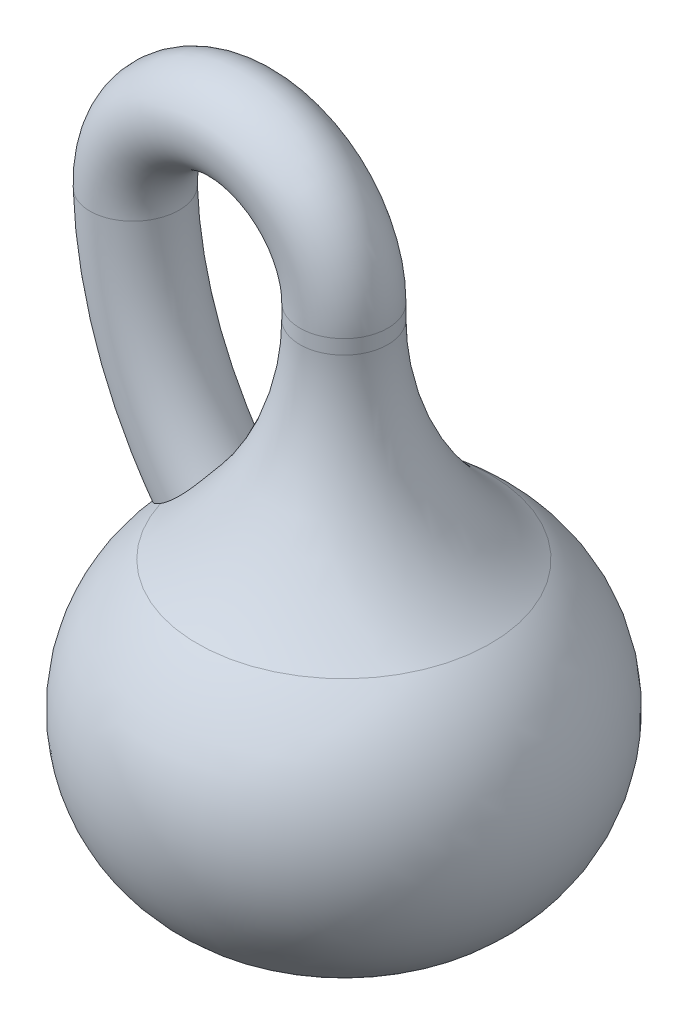
ISO-10303-21;
HEADER;
FILE_DESCRIPTION(('STEP AP214'),'2;1');
FILE_NAME('part.step','',(''),(''),'','','');
FILE_SCHEMA(('AUTOMOTIVE_DESIGN { 1 0 10303 214 1 1 1 1 }'));
ENDSEC;
DATA;
#1=APPLICATION_CONTEXT('core data for automotive mechanical design processes');
#2=APPLICATION_PROTOCOL_DEFINITION('international standard','automotive_design',2000,#1);
#3=PRODUCT_CONTEXT('',#1,'mechanical');
#4=PRODUCT('Part','Part','',(#3));
#5=PRODUCT_RELATED_PRODUCT_CATEGORY('part','',(#4));
#6=PRODUCT_DEFINITION_FORMATION('','',#4);
#7=PRODUCT_DEFINITION_CONTEXT('part definition',#1,'design');
#8=PRODUCT_DEFINITION('design','',#6,#7);
#9=PRODUCT_DEFINITION_SHAPE('','',#8);
#10=(LENGTH_UNIT() NAMED_UNIT(*) SI_UNIT(.MILLI.,.METRE.));
#11=(NAMED_UNIT(*) PLANE_ANGLE_UNIT() SI_UNIT($,.RADIAN.));
#12=(NAMED_UNIT(*) SI_UNIT($,.STERADIAN.) SOLID_ANGLE_UNIT());
#13=UNCERTAINTY_MEASURE_WITH_UNIT(LENGTH_MEASURE(1.E-05),#10,'distance_accuracy_value','');
#14=(GEOMETRIC_REPRESENTATION_CONTEXT(3) GLOBAL_UNCERTAINTY_ASSIGNED_CONTEXT((#13)) GLOBAL_UNIT_ASSIGNED_CONTEXT((#10,
#11,#12)) REPRESENTATION_CONTEXT('',''));
#15=CARTESIAN_POINT('',(0.,0.,0.));
#16=DIRECTION('',(0.,0.,1.));
#17=DIRECTION('',(1.,0.,0.));
#18=AXIS2_PLACEMENT_3D('',#15,#16,#17);
#19=CARTESIAN_POINT('',(0.,42.8365456913328,0.));
#20=DIRECTION('',(0.,-1.,0.));
#21=DIRECTION('',(0.,0.,-1.));
#22=AXIS2_PLACEMENT_3D('',#19,#20,#21);
#23=DEGENERATE_TOROIDAL_SURFACE('',#22,16.120862887604,53.7757953987175,.T.);
#24=CARTESIAN_POINT('',(0.,1.53602634924748,0.));
#25=DIRECTION('',(0.,-1.,0.));
#26=DIRECTION('',(0.,0.,-1.));
#27=AXIS2_PLACEMENT_3D('',#24,#25,#26);
#28=CIRCLE('',#27,50.5607129575268);
#29=CARTESIAN_POINT('',(0.,1.53602634924748,-50.5607129575268));
#30=VERTEX_POINT('',#29);
#31=EDGE_CURVE('E192',#30,#30,#28,.T.);
#32=ORIENTED_EDGE('',*,*,#31,.T.);
#33=EDGE_LOOP('',(#32));
#34=FACE_BOUND('',#33,.T.);
#35=CARTESIAN_POINT('',(0.,85.5366049313641,0.));
#36=DIRECTION('',(0.,-1.,0.));
#37=DIRECTION('',(0.,0.,-1.));
#38=AXIS2_PLACEMENT_3D('',#35,#36,#37);
#39=CIRCLE('',#38,48.8094099899538);
#40=CARTESIAN_POINT('',(-46.5056257680989,85.5366049313641,-14.8184100187889));
#41=VERTEX_POINT('',#40);
#42=CARTESIAN_POINT('',(-46.5056257680813,85.5366049313761,14.8184100187923));
#43=VERTEX_POINT('',#42);
#44=EDGE_CURVE('E189',#41,#43,#39,.T.);
#45=ORIENTED_EDGE('',*,*,#44,.F.);
#46=CARTESIAN_POINT('',(-46.5053338876145,85.5368049313641,-14.8184655134667));
#47=CARTESIAN_POINT('',(-46.6769958380702,85.4191805977686,-14.7858302183833));
#48=CARTESIAN_POINT('',(-46.8478711767004,85.3016673806059,-14.748822017268));
#49=CARTESIAN_POINT('',(-47.1878061404452,85.0670738837785,-14.6661173714288));
#50=CARTESIAN_POINT('',(-47.3568657700678,84.9499936030395,-14.6204209482812));
#51=CARTESIAN_POINT('',(-47.8608673315789,84.5997807890334,-14.47041259759));
#52=CARTESIAN_POINT('',(-48.1927254764483,84.3676121407598,-14.3531637917121));
#53=CARTESIAN_POINT('',(-48.8455651841783,83.9080707491798,-14.0851257433831));
#54=CARTESIAN_POINT('',(-49.1665547727168,83.6806945160107,-13.9343619006291));
#55=CARTESIAN_POINT('',(-49.7958694631979,83.2323991524789,-13.6002891930876));
#56=CARTESIAN_POINT('',(-50.1041947192677,83.0114799435425,-13.4169807245182));
#57=CARTESIAN_POINT('',(-50.7063034587822,82.5778405126457,-13.0190222694967));
#58=CARTESIAN_POINT('',(-51.000080114568,82.3651241504539,-12.8043577508354));
#59=CARTESIAN_POINT('',(-51.5710417266935,81.9497728389871,-12.3452707943102));
#60=CARTESIAN_POINT('',(-51.848226665988,81.7471379000692,-12.1008483258755));
#61=CARTESIAN_POINT('',(-52.3841726281171,81.3536852638387,-11.5840275859623));
#62=CARTESIAN_POINT('',(-52.6429370065743,81.1628654150327,-11.3116344320222));
#63=CARTESIAN_POINT('',(-53.1404435615613,80.794607594974,-10.7407693391473));
#64=CARTESIAN_POINT('',(-53.3791858214189,80.6171695680293,-10.4422975087568));
#65=CARTESIAN_POINT('',(-53.8352599987771,80.2770749510186,-9.821217015969));
#66=CARTESIAN_POINT('',(-54.0525798184985,80.1144267170878,-9.49859489418369));
#67=CARTESIAN_POINT('',(-54.4642805509525,79.805399939911,-8.83165128029079));
#68=CARTESIAN_POINT('',(-54.6586614163508,79.6590214302374,-8.48732974340897));
#69=CARTESIAN_POINT('',(-55.0232849972736,79.3837549311377,-7.77937733104285));
#70=CARTESIAN_POINT('',(-55.1935240218744,79.2548696162864,-7.41574351465777));
#71=CARTESIAN_POINT('',(-55.5087573468555,79.0157118062567,-6.67179561551695));
#72=CARTESIAN_POINT('',(-55.6537516459314,78.9054393120401,-6.29148153189933));
#73=CARTESIAN_POINT('',(-55.9176920372423,78.7043653774424,-5.51655844247417));
#74=CARTESIAN_POINT('',(-56.0366169933893,78.6135797375355,-5.12193813753853));
#75=CARTESIAN_POINT('',(-56.2475234718464,78.4523684737571,-4.32149748827359));
#76=CARTESIAN_POINT('',(-56.3395049766344,78.3819428631264,-3.91567713666071));
#77=CARTESIAN_POINT('',(-56.4959434343787,78.2620582227838,-3.09574511021912));
#78=CARTESIAN_POINT('',(-56.5604020252637,78.2125979453956,-2.68163393032558));
#79=CARTESIAN_POINT('',(-56.6613990878012,78.1350618127813,-1.8480398168174));
#80=CARTESIAN_POINT('',(-56.6979375633438,78.1069859545757,-1.42855688395121));
#81=CARTESIAN_POINT('',(-56.7428697532349,78.0724564417622,-0.587126838233722));
#82=CARTESIAN_POINT('',(-56.7512585468553,78.0660065675023,-0.165179307468685));
#83=CARTESIAN_POINT('',(-56.7398251067923,78.0747949715809,0.678107305485353));
#84=CARTESIAN_POINT('',(-56.7200028669664,78.0900332546418,1.09944638754185));
#85=CARTESIAN_POINT('',(-56.6522706924194,78.1420677268621,1.93852895755985));
#86=CARTESIAN_POINT('',(-56.6043601896395,78.1788643520188,2.35627237262898));
#87=CARTESIAN_POINT('',(-56.4807509429555,78.2737002046965,3.18518494288495));
#88=CARTESIAN_POINT('',(-56.4050522011797,78.3317394305906,3.59635409857528));
#89=CARTESIAN_POINT('',(-56.226341740963,78.4685622631636,4.40919028072045));
#90=CARTESIAN_POINT('',(-56.1233303482064,78.5473456224833,4.81085742041796));
#91=CARTESIAN_POINT('',(-55.8906401398191,78.7249827880849,5.60183949718955));
#92=CARTESIAN_POINT('',(-55.7609613149131,78.8238366013476,5.99115442996732));
#93=CARTESIAN_POINT('',(-55.4757558564215,79.0407661292009,6.75465095925224));
#94=CARTESIAN_POINT('',(-55.3202301338032,79.1588411663415,7.12883308853348));
#95=CARTESIAN_POINT('',(-54.9843068682555,79.4132084317665,7.85941793234453));
#96=CARTESIAN_POINT('',(-54.8039093652528,79.5495006308068,8.21582067541436));
#97=CARTESIAN_POINT('',(-54.419399086123,79.8391287783713,8.90828051302501));
#98=CARTESIAN_POINT('',(-54.2152885463092,79.9924631196374,9.24433952158996));
#99=CARTESIAN_POINT('',(-53.7846295262107,80.3148852711624,9.89376058600659));
#100=CARTESIAN_POINT('',(-53.5580808986205,80.4839731848428,10.207122492829));
#101=CARTESIAN_POINT('',(-53.0839282147186,80.8365134080911,10.8089923629054));
#102=CARTESIAN_POINT('',(-52.8363189384769,81.0199692778921,11.097494128638));
#103=CARTESIAN_POINT('',(-52.3216829437374,81.3996531693806,11.6474947824));
#104=CARTESIAN_POINT('',(-52.0546567499296,81.5958808459294,11.9089943996279));
#105=CARTESIAN_POINT('',(-51.5028940232815,81.999461469155,12.4031405985359));
#106=CARTESIAN_POINT('',(-51.218157274816,82.206814551279,12.6357868288241));
#107=CARTESIAN_POINT('',(-50.6328168296268,82.6309026747812,13.0705667266243));
#108=CARTESIAN_POINT('',(-50.3322132031298,82.8476376746344,13.2727005291686));
#109=CARTESIAN_POINT('',(-49.7174203404749,83.2884437968212,13.6448254337942));
#110=CARTESIAN_POINT('',(-49.403245556732,83.5125070561269,13.8148497417453));
#111=CARTESIAN_POINT('',(-48.7631886176889,83.9662409671195,14.1217579534816));
#112=CARTESIAN_POINT('',(-48.4373115520113,84.1959091674759,14.2586560689357));
#113=CARTESIAN_POINT('',(-47.8448160247032,84.6107736584683,14.4734546010261));
#114=CARTESIAN_POINT('',(-47.579989752853,84.7952708676536,14.5577042859634));
#115=CARTESIAN_POINT('',(-47.0458609090396,85.1653633203737,14.7044152358997));
#116=CARTESIAN_POINT('',(-46.7765672347795,85.3509559954111,14.7669153771363));
#117=CARTESIAN_POINT('',(-46.5053338876145,85.5368049313641,14.8184655134667));
#118=B_SPLINE_CURVE_WITH_KNOTS('',3,(#46,#47,#48,#49,#50,#51,#52,#53,#54,#55,#56,#57,#58,#59,
#60,#61,#62,#63,#64,#65,#66,#67,#68,#69,#70,#71,#72,#73,#74,#75,#76,#77,#78,#79,#80,#81,#82,#83,
#84,#85,#86,#87,#88,#89,#90,#91,#92,#93,#94,#95,#96,#97,#98,#99,#100,#101,#102,#103,#104,#105,
#106,#107,#108,#109,#110,#111,#112,#113,#114,#115,#116,#117),.UNSPECIFIED.,.F.,.F.,(4,2,2,2,2,2,
2,2,2,2,2,2,2,2,2,2,2,2,2,2,2,2,2,2,2,2,2,2,2,2,2,2,2,2,2,4),(0.,0.631816015730672,
1.26363046242826,2.52691603998691,3.78924746853159,5.05156352973586,6.3144664885019,
7.57737074467926,8.84004434922056,10.1027126985243,11.366090071107,12.6294700506074,
13.8930429741125,15.1566159629081,16.4212096530717,17.6858041656409,18.9503234098573,
20.2148424778882,21.4795825797015,22.7443229568948,24.0090889131594,25.2738547725625,
26.5386055511991,27.8033567697344,29.0680634218867,30.3327680438274,31.5973534915114,
32.8619472417159,34.126855342854,35.3917292759549,36.6566186118524,37.9215023498367,
39.1850707646778,40.4480961234208,41.4480941864173,42.4462955085632),.UNSPECIFIED.);
#119=EDGE_CURVE('E85',#41,#43,#118,.T.);
#120=ORIENTED_EDGE('',*,*,#119,.T.);
#121=EDGE_LOOP('',(#45,#120));
#122=FACE_BOUND('',#121,.T.);
#123=ADVANCED_FACE('F65',(#34,#122),#23,.F.);
#124=CARTESIAN_POINT('',(0.,158.047911595543,0.));
#125=DIRECTION('',(0.,-1.,0.));
#126=DIRECTION('',(0.,0.,-1.));
#127=AXIS2_PLACEMENT_3D('',#124,#125,#126);
#128=TOROIDAL_SURFACE('',#127,104.319620175395,91.3196201753954);
#129=CARTESIAN_POINT('',(0.,158.047911595543,0.));
#130=DIRECTION('',(0.,-1.,0.));
#131=DIRECTION('',(0.,0.,-1.));
#132=AXIS2_PLACEMENT_3D('',#129,#130,#131);
#133=CIRCLE('',#132,13.);
#134=CARTESIAN_POINT('',(0.,158.047911595543,-13.));
#135=VERTEX_POINT('',#134);
#136=EDGE_CURVE('E100',#135,#135,#133,.T.);
#137=ORIENTED_EDGE('',*,*,#136,.F.);
#138=EDGE_LOOP('',(#137));
#139=FACE_BOUND('',#138,.T.);
#140=ORIENTED_EDGE('',*,*,#44,.T.);
#141=CARTESIAN_POINT('',(-46.5059176502572,85.536404931364,14.8183545152641));
#142=CARTESIAN_POINT('',(-46.3429248897037,85.6480871292386,14.8493511167539));
#143=CARTESIAN_POINT('',(-46.1801222963115,85.7610994981925,14.8764089196964));
#144=CARTESIAN_POINT('',(-45.8552034529609,85.989706795278,14.9226008455291));
#145=CARTESIAN_POINT('',(-45.6930872159398,86.1053017718341,14.9417348197138));
#146=CARTESIAN_POINT('',(-45.2082956295894,86.4557946354134,14.9871747812597));
#147=CARTESIAN_POINT('',(-44.8871172863406,86.6944415527756,15.0015302309919));
#148=CARTESIAN_POINT('',(-44.2522884466735,87.1800586120134,14.9982140929331));
#149=CARTESIAN_POINT('',(-43.9386250699475,87.4270124621039,14.9806019735738));
#150=CARTESIAN_POINT('',(-43.3207875633058,87.9283676206993,14.9136533908986));
#151=CARTESIAN_POINT('',(-43.0166129082231,88.1827685155208,14.8643186865926));
#152=CARTESIAN_POINT('',(-42.4198883046508,88.697708581783,14.7343604840981));
#153=CARTESIAN_POINT('',(-42.1273493664703,88.9582532121538,14.653708093165));
#154=CARTESIAN_POINT('',(-41.5563226833659,89.4834946707734,14.4619261806563));
#155=CARTESIAN_POINT('',(-41.2778352803227,89.7481915998443,14.3507959179619));
#156=CARTESIAN_POINT('',(-40.7367559012637,90.2797341323604,14.0991744070824));
#157=CARTESIAN_POINT('',(-40.4741609141883,90.5465793178619,13.9586887433245));
#158=CARTESIAN_POINT('',(-39.9661881518364,91.0803870147094,13.6496579618115));
#159=CARTESIAN_POINT('',(-39.7208104619509,91.3473495266306,13.4811127049058));
#160=CARTESIAN_POINT('',(-39.2461588118954,91.881548657597,13.1158303169334));
#161=CARTESIAN_POINT('',(-39.0170450093713,92.1487671357692,12.9188588381464));
#162=CARTESIAN_POINT('',(-38.5778841837598,92.6788056407067,12.4994289414442));
#163=CARTESIAN_POINT('',(-38.3678372704977,92.9416256421297,12.2769703767399));
#164=CARTESIAN_POINT('',(-37.9668754538572,93.4606841275058,11.8079918809403));
#165=CARTESIAN_POINT('',(-37.7759729315639,93.7169182736053,11.5614565797249));
#166=CARTESIAN_POINT('',(-37.4133351511678,94.2202324282123,11.045963139725));
#167=CARTESIAN_POINT('',(-37.24160087348,94.4673119680497,10.7770038552294));
#168=CARTESIAN_POINT('',(-36.9043944558103,94.968527595734,10.1964619456962));
#169=CARTESIAN_POINT('',(-36.7404358926518,95.221729601102,9.883191542563));
#170=CARTESIAN_POINT('',(-36.4337637207078,95.711428886429,9.23399173343551));
#171=CARTESIAN_POINT('',(-36.2910512525003,95.9479252692036,8.89806111235316));
#172=CARTESIAN_POINT('',(-36.0261041806579,96.40094216244,8.20503500773627));
#173=CARTESIAN_POINT('',(-35.903879189282,96.6174532749813,7.84792969529272));
#174=CARTESIAN_POINT('',(-35.6792867307101,97.0268097585748,7.11443822494974));
#175=CARTESIAN_POINT('',(-35.5769178774526,97.2196567811578,6.73805341517948));
#176=CARTESIAN_POINT('',(-35.3887177486386,97.5831731716081,5.95682290033433));
#177=CARTESIAN_POINT('',(-35.303445779787,97.7530466635366,5.55147028255097));
#178=CARTESIAN_POINT('',(-35.1526549075231,98.0598518411249,4.72486396105559));
#179=CARTESIAN_POINT('',(-35.0871364767145,98.1967827386168,4.30360987717198));
#180=CARTESIAN_POINT('',(-34.9755199556181,98.4337570013402,3.4489547907748));
#181=CARTESIAN_POINT('',(-34.9293940812568,98.533853114609,3.0155721218292));
#182=CARTESIAN_POINT('',(-34.8561682840303,98.6942895369436,2.13994121327199));
#183=CARTESIAN_POINT('',(-34.8290649394543,98.754636995748,1.69769458280898));
#184=CARTESIAN_POINT('',(-34.7958888765373,98.8287392580143,0.863003299805625));
#185=CARTESIAN_POINT('',(-34.7876544647867,98.8472787462608,0.471062639357963));
#186=CARTESIAN_POINT('',(-34.7857040515596,98.8516587156868,-0.313021565043685));
#187=CARTESIAN_POINT('',(-34.7919868173425,98.8375019732989,-0.705165088944283));
#188=CARTESIAN_POINT('',(-34.8190932779934,98.7768788368601,-1.48645172682978));
#189=CARTESIAN_POINT('',(-34.8399181236988,98.7304098856728,-1.87559460088352));
#190=CARTESIAN_POINT('',(-34.8961921933401,98.6063981057541,-2.64780788810428));
#191=CARTESIAN_POINT('',(-34.9316415077639,98.528855084754,-3.03087826368292));
#192=CARTESIAN_POINT('',(-35.0145696830843,98.3505300645433,-3.76395141331984));
#193=CARTESIAN_POINT('',(-35.0611328406498,98.2515542012124,-4.11450086740046));
#194=CARTESIAN_POINT('',(-35.1674126290988,98.0299879290856,-4.80612441024752));
#195=CARTESIAN_POINT('',(-35.2271337276309,97.9073895012597,-5.14719523623662));
#196=CARTESIAN_POINT('',(-35.3599734524905,97.6407706231584,-5.81809428437162));
#197=CARTESIAN_POINT('',(-35.4330904131855,97.4967528365704,-6.1479238982019));
#198=CARTESIAN_POINT('',(-35.5930900327427,97.189447378946,-6.79518796433296));
#199=CARTESIAN_POINT('',(-35.6799788837255,97.0261510483536,-7.11261676056724));
#200=CARTESIAN_POINT('',(-35.8786100868928,96.6629482881661,-7.76921333115509));
#201=CARTESIAN_POINT('',(-35.9920566552969,96.4609905218575,-8.10673279265395));
#202=CARTESIAN_POINT('',(-36.2370368487981,96.0390065460238,-8.76321807750874));
#203=CARTESIAN_POINT('',(-36.3685648130852,95.8189860001308,-9.08218966341658));
#204=CARTESIAN_POINT('',(-36.6504675338775,95.3634282534362,-9.70062110233217));
#205=CARTESIAN_POINT('',(-36.8008598083982,95.1278767277742,-10.0000624208552));
#206=CARTESIAN_POINT('',(-37.1208732529288,94.6442356469068,-10.5775940607116));
#207=CARTESIAN_POINT('',(-37.2904881430337,94.3961502010472,-10.855691305504));
#208=CARTESIAN_POINT('',(-37.6670697192517,93.8650379424349,-11.4154348943577));
#209=CARTESIAN_POINT('',(-37.8760694996269,93.580974945083,-11.6947379841511));
#210=CARTESIAN_POINT('',(-38.3180460804148,93.004093121221,-12.2238505122443));
#211=CARTESIAN_POINT('',(-38.5510245960616,92.7112736694134,-12.4736578379209));
#212=CARTESIAN_POINT('',(-39.0406065179087,92.1202800313527,-12.941479206672));
#213=CARTESIAN_POINT('',(-39.29719994243,91.8221081500038,-13.1595065828939));
#214=CARTESIAN_POINT('',(-39.8332584041226,91.2234998616826,-13.5616898800356));
#215=CARTESIAN_POINT('',(-40.1127212424257,90.9230636749366,-13.7458490518284));
#216=CARTESIAN_POINT('',(-40.6793936794265,90.3371117948204,-14.0704394922468));
#217=CARTESIAN_POINT('',(-40.9656203863909,90.0515590741037,-14.212520298258));
#218=CARTESIAN_POINT('',(-41.5557009507243,89.4836691875053,-14.4625400141363));
#219=CARTESIAN_POINT('',(-41.8595556816412,89.2013321818075,-14.5704772303218));
#220=CARTESIAN_POINT('',(-42.4823397885529,88.6423776089589,-14.7509184559858));
#221=CARTESIAN_POINT('',(-42.8012610812007,88.3657570868458,-14.8234412340869));
#222=CARTESIAN_POINT('',(-43.4514971792396,87.8201928179191,-14.9322815937047));
#223=CARTESIAN_POINT('',(-43.7828079229754,87.5512466053253,-14.9686109344729));
#224=CARTESIAN_POINT('',(-44.3132799068693,87.13401540332,-14.9971034297543));
#225=CARTESIAN_POINT('',(-44.5093955660386,86.9825705586143,-15.0014176730335));
#226=CARTESIAN_POINT('',(-44.9041473060828,86.6830961920036,-14.9977700632438));
#227=CARTESIAN_POINT('',(-45.1027835454287,86.5350668865018,-14.9898074344872));
#228=CARTESIAN_POINT('',(-45.501546157652,86.2429685899308,-14.9616503006891));
#229=CARTESIAN_POINT('',(-45.7016693116551,86.0988931172145,-14.9414772416192));
#230=CARTESIAN_POINT('',(-46.1030797409515,85.8146600952126,-14.8889965925704));
#231=CARTESIAN_POINT('',(-46.3043669219956,85.6745022339404,-14.8566899718465));
#232=CARTESIAN_POINT('',(-46.5059176502572,85.536404931364,-14.8183545152641));
#233=B_SPLINE_CURVE_WITH_KNOTS('',3,(#141,#142,#143,#144,#145,#146,#147,#148,#149,#150,#151,
#152,#153,#154,#155,#156,#157,#158,#159,#160,#161,#162,#163,#164,#165,#166,#167,#168,#169,#170,
#171,#172,#173,#174,#175,#176,#177,#178,#179,#180,#181,#182,#183,#184,#185,#186,#187,#188,#189,
#190,#191,#192,#193,#194,#195,#196,#197,#198,#199,#200,#201,#202,#203,#204,#205,#206,#207,#208,
#209,#210,#211,#212,#213,#214,#215,#216,#217,#218,#219,#220,#221,#222,#223,#224,#225,#226,#227,
#228,#229,#230,#231,#232),.UNSPECIFIED.,.F.,.F.,(4,2,2,2,2,2,2,2,2,2,2,2,2,2,2,2,2,2,2,2,2,2,2,
2,2,2,2,2,2,2,2,2,2,2,2,2,2,2,2,2,2,2,2,2,2,4),(0.,0.599913033035334,1.19983732404725,
2.39946546849556,3.59686426286918,4.79419666747871,5.99263632908619,7.19110513527234,
8.38934615786243,9.58759312284007,10.7963519562649,12.0051177517087,13.2146603075272,
14.4242647005518,15.7274949970065,17.0307952310216,18.3347052426676,19.6385242018456,
20.9797835902589,22.3210750657794,23.6604382449895,24.9995604421166,26.1753688746993,
27.3510774660191,28.5268791116203,29.7026880325196,30.8032017531176,31.9040897197108,
33.0048408954176,34.1060884024528,35.3329053446177,36.5593390736372,37.7869202599395,
39.0141015531842,40.3620325072946,41.7100599479744,43.0575201912816,44.4048510297031,
45.6887994876419,46.9728116254433,48.2561425336097,49.5390563513176,50.2822247985691,
51.0254402032327,51.7673540229509,52.5092085895996),.UNSPECIFIED.);
#234=EDGE_CURVE('E106',#43,#41,#233,.T.);
#235=ORIENTED_EDGE('',*,*,#234,.T.);
#236=EDGE_LOOP('',(#140,#235));
#237=FACE_BOUND('',#236,.T.);
#238=ADVANCED_FACE('F128',(#139,#237),#128,.T.);
#239=CARTESIAN_POINT('',(0.,0.,0.));
#240=DIRECTION('',(0.,-1.,0.));
#241=DIRECTION('',(0.,0.,-1.));
#242=AXIS2_PLACEMENT_3D('',#239,#240,#241);
#243=CYLINDRICAL_SURFACE('',#242,15.);
#244=CARTESIAN_POINT('',(0.,18.1847274443698,0.));
#245=DIRECTION('',(0.,-1.,0.));
#246=DIRECTION('',(0.,0.,-1.));
#247=AXIS2_PLACEMENT_3D('',#244,#245,#246);
#248=CIRCLE('',#247,15.);
#249=CARTESIAN_POINT('',(0.,18.1847274443698,-15.));
#250=VERTEX_POINT('',#249);
#251=EDGE_CURVE('E79',#250,#250,#248,.T.);
#252=ORIENTED_EDGE('',*,*,#251,.F.);
#253=EDGE_LOOP('',(#252));
#254=FACE_BOUND('',#253,.T.);
#255=CARTESIAN_POINT('',(0.,35.1240677183367,0.));
#256=DIRECTION('',(0.,1.,0.));
#257=DIRECTION('',(-1.,0.,0.));
#258=AXIS2_PLACEMENT_3D('',#255,#256,#257);
#259=CIRCLE('',#258,15.);
#260=CARTESIAN_POINT('',(15.,35.1240677183367,0.));
#261=VERTEX_POINT('',#260);
#262=EDGE_CURVE('E107',#261,#261,#259,.T.);
#263=ORIENTED_EDGE('',*,*,#262,.F.);
#264=EDGE_LOOP('',(#263));
#265=FACE_BOUND('',#264,.T.);
#266=ADVANCED_FACE('F67',(#254,#265),#243,.T.);
#267=CARTESIAN_POINT('',(0.,18.1847274443698,0.));
#268=DIRECTION('',(0.,-1.,0.));
#269=DIRECTION('',(0.,0.,-1.));
#270=AXIS2_PLACEMENT_3D('',#267,#268,#269);
#271=TOROIDAL_SURFACE('',#270,36.6776243497111,21.6776243497111);
#272=ORIENTED_EDGE('',*,*,#251,.T.);
#273=EDGE_LOOP('',(#272));
#274=FACE_BOUND('',#273,.T.);
#275=ORIENTED_EDGE('',*,*,#31,.F.);
#276=EDGE_LOOP('',(#275));
#277=FACE_BOUND('',#276,.T.);
#278=ADVANCED_FACE('F141',(#274,#277),#271,.F.);
#279=CARTESIAN_POINT('',(-24.8846611214487,35.1240677183367,0.));
#280=DIRECTION('',(0.,0.,-1.));
#281=DIRECTION('',(-1.,0.,0.));
#282=AXIS2_PLACEMENT_3D('',#279,#280,#281);
#283=TOROIDAL_SURFACE('',#282,24.8846611214487,15.);
#284=CARTESIAN_POINT('',(-11.3548925089494,56.0092711030674,0.));
#285=DIRECTION('',(-0.839280200875602,0.543699130418846,0.));
#286=DIRECTION('',(-0.543699130418846,-0.839280200875602,0.));
#287=AXIS2_PLACEMENT_3D('',#284,#285,#286);
#288=CIRCLE('',#287,15.);
#289=CARTESIAN_POINT('',(-3.19940555266665,68.5984741162015,0.));
#290=VERTEX_POINT('',#289);
#291=EDGE_CURVE('E203',#290,#290,#288,.T.);
#292=CARTESIAN_POINT('',(-24.8846611214487,35.1240677183367,0.));
#293=DIRECTION('',(0.,0.,-1.));
#294=DIRECTION('',(-1.,0.,0.));
#295=AXIS2_PLACEMENT_3D('',#292,#293,#294);
#296=CIRCLE('',#295,39.8846611214487);
#297=EDGE_CURVE('',#290,#261,#296,.T.);
#298=ORIENTED_EDGE('',*,*,#291,.F.);
#299=ORIENTED_EDGE('',*,*,#262,.T.);
#300=ORIENTED_EDGE('',*,*,#297,.T.);
#301=ORIENTED_EDGE('',*,*,#297,.F.);
#302=EDGE_LOOP('',(#298,#300,#299,#301));
#303=FACE_BOUND('',#302,.T.);
#304=ADVANCED_FACE('F125',(#303),#283,.T.);
#305=CARTESIAN_POINT('',(60.0990093746592,166.30896034484,0.));
#306=DIRECTION('',(0.,0.,1.));
#307=DIRECTION('',(1.,0.,0.));
#308=AXIS2_PLACEMENT_3D('',#305,#306,#307);
#309=TOROIDAL_SURFACE('',#308,131.421769662503,15.);
#310=ORIENTED_EDGE('',*,*,#119,.F.);
#311=ORIENTED_EDGE('',*,*,#234,.F.);
#312=EDGE_LOOP('',(#310,#311));
#313=FACE_BOUND('',#312,.T.);
#314=ORIENTED_EDGE('',*,*,#291,.T.);
#315=EDGE_LOOP('',(#314));
#316=FACE_BOUND('',#315,.T.);
#317=ADVANCED_FACE('F114',(#313,#316),#309,.T.);
#318=CARTESIAN_POINT('',(0.,158.047911595543,0.));
#319=DIRECTION('',(0.,1.,0.));
#320=DIRECTION('',(-1.,0.,0.));
#321=AXIS2_PLACEMENT_3D('',#318,#319,#320);
#322=CYLINDRICAL_SURFACE('',#321,13.);
#323=CARTESIAN_POINT('',(0.,162.921744898973,0.));
#324=DIRECTION('',(0.,1.,0.));
#325=DIRECTION('',(-1.,0.,0.));
#326=AXIS2_PLACEMENT_3D('',#323,#324,#325);
#327=CIRCLE('',#326,13.);
#328=CARTESIAN_POINT('',(13.,162.921744898973,0.));
#329=VERTEX_POINT('',#328);
#330=EDGE_CURVE('E226',#329,#329,#327,.F.);
#331=ORIENTED_EDGE('',*,*,#330,.F.);
#332=EDGE_LOOP('',(#331));
#333=FACE_BOUND('',#332,.T.);
#334=ORIENTED_EDGE('',*,*,#136,.T.);
#335=EDGE_LOOP('',(#334));
#336=FACE_BOUND('',#335,.T.);
#337=ADVANCED_FACE('F124',(#333,#336),#322,.F.);
#338=CARTESIAN_POINT('',(-35.6314271838972,162.921744898973,0.));
#339=DIRECTION('',(0.,0.,1.));
#340=DIRECTION('',(1.,0.,0.));
#341=AXIS2_PLACEMENT_3D('',#338,#339,#340);
#342=TOROIDAL_SURFACE('',#341,35.6314271838972,13.);
#343=CARTESIAN_POINT('',(-71.240570979168,161.661791991481,0.));
#344=DIRECTION('',(-0.0353607196531657,0.999374614199105,0.));
#345=DIRECTION('',(-0.999374614199105,-0.0353607196531657,0.));
#346=AXIS2_PLACEMENT_3D('',#343,#344,#345);
#347=CIRCLE('',#346,13.);
#348=CARTESIAN_POINT('',(-84.2324409637564,161.20210263599,0.));
#349=VERTEX_POINT('',#348);
#350=EDGE_CURVE('E223',#349,#349,#347,.T.);
#351=CARTESIAN_POINT('',(-35.6314271838972,162.921744898973,0.));
#352=DIRECTION('',(0.,0.,1.));
#353=DIRECTION('',(1.,0.,0.));
#354=AXIS2_PLACEMENT_3D('',#351,#352,#353);
#355=CIRCLE('',#354,48.6314271838972);
#356=EDGE_CURVE('',#329,#349,#355,.T.);
#357=ORIENTED_EDGE('',*,*,#330,.T.);
#358=ORIENTED_EDGE('',*,*,#350,.F.);
#359=ORIENTED_EDGE('',*,*,#356,.T.);
#360=ORIENTED_EDGE('',*,*,#356,.F.);
#361=EDGE_LOOP('',(#357,#359,#358,#360));
#362=FACE_BOUND('',#361,.T.);
#363=ADVANCED_FACE('F230',(#362),#342,.F.);
#364=CARTESIAN_POINT('',(60.0990093746592,166.30896034484,0.));
#365=DIRECTION('',(0.,0.,1.));
#366=DIRECTION('',(1.,0.,0.));
#367=AXIS2_PLACEMENT_3D('',#364,#365,#366);
#368=TOROIDAL_SURFACE('',#367,131.421769662503,13.);
#369=CARTESIAN_POINT('',(-11.3548925089494,56.0092711030674,0.));
#370=DIRECTION('',(-0.839280200875602,0.543699130418846,0.));
#371=DIRECTION('',(-0.543699130418846,-0.839280200875602,0.));
#372=AXIS2_PLACEMENT_3D('',#369,#370,#371);
#373=CIRCLE('',#372,13.);
#374=CARTESIAN_POINT('',(-18.4229812043944,45.0986284916846,0.));
#375=VERTEX_POINT('',#374);
#376=EDGE_CURVE('E220',#375,#375,#373,.T.);
#377=CARTESIAN_POINT('',(60.0990093746592,166.30896034484,0.));
#378=DIRECTION('',(0.,0.,1.));
#379=DIRECTION('',(1.,0.,0.));
#380=AXIS2_PLACEMENT_3D('',#377,#378,#379);
#381=CIRCLE('',#380,144.421769662503);
#382=EDGE_CURVE('',#349,#375,#381,.T.);
#383=ORIENTED_EDGE('',*,*,#350,.T.);
#384=ORIENTED_EDGE('',*,*,#376,.F.);
#385=ORIENTED_EDGE('',*,*,#382,.T.);
#386=ORIENTED_EDGE('',*,*,#382,.F.);
#387=EDGE_LOOP('',(#383,#385,#384,#386));
#388=FACE_BOUND('',#387,.T.);
#389=ADVANCED_FACE('F241',(#388),#368,.F.);
#390=CARTESIAN_POINT('',(-24.8846611214487,35.1240677183367,0.));
#391=DIRECTION('',(0.,0.,-1.));
#392=DIRECTION('',(-1.,0.,0.));
#393=AXIS2_PLACEMENT_3D('',#390,#391,#392);
#394=TOROIDAL_SURFACE('',#393,24.8846611214487,13.);
#395=CARTESIAN_POINT('',(0.,35.1240677183367,0.));
#396=DIRECTION('',(0.,1.,0.));
#397=DIRECTION('',(-1.,0.,0.));
#398=AXIS2_PLACEMENT_3D('',#395,#396,#397);
#399=CIRCLE('',#398,13.);
#400=CARTESIAN_POINT('',(-13.,35.1240677183367,0.));
#401=VERTEX_POINT('',#400);
#402=EDGE_CURVE('E217',#401,#401,#399,.T.);
#403=ORIENTED_EDGE('',*,*,#402,.F.);
#404=EDGE_LOOP('',(#403));
#405=FACE_BOUND('',#404,.T.);
#406=ORIENTED_EDGE('',*,*,#376,.T.);
#407=EDGE_LOOP('',(#406));
#408=FACE_BOUND('',#407,.T.);
#409=ADVANCED_FACE('F126',(#405,#408),#394,.F.);
#410=CARTESIAN_POINT('',(0.,0.,0.));
#411=DIRECTION('',(0.,-1.,0.));
#412=DIRECTION('',(0.,0.,-1.));
#413=AXIS2_PLACEMENT_3D('',#410,#411,#412);
#414=CYLINDRICAL_SURFACE('',#413,13.);
#415=CARTESIAN_POINT('',(0.,18.1847274443698,0.));
#416=DIRECTION('',(0.,-1.,0.));
#417=DIRECTION('',(0.,0.,-1.));
#418=AXIS2_PLACEMENT_3D('',#415,#416,#417);
#419=CIRCLE('',#418,13.);
#420=CARTESIAN_POINT('',(0.,18.1847274443698,-13.));
#421=VERTEX_POINT('',#420);
#422=EDGE_CURVE('E149',#421,#421,#419,.T.);
#423=ORIENTED_EDGE('',*,*,#422,.T.);
#424=EDGE_LOOP('',(#423));
#425=FACE_BOUND('',#424,.T.);
#426=ORIENTED_EDGE('',*,*,#402,.T.);
#427=EDGE_LOOP('',(#426));
#428=FACE_BOUND('',#427,.T.);
#429=ADVANCED_FACE('F157',(#425,#428),#414,.F.);
#430=CARTESIAN_POINT('',(0.,18.1847274443698,0.));
#431=DIRECTION('',(0.,-1.,0.));
#432=DIRECTION('',(0.,0.,-1.));
#433=AXIS2_PLACEMENT_3D('',#430,#431,#432);
#434=TOROIDAL_SURFACE('',#433,36.6776243497111,23.6776243497111);
#435=ORIENTED_EDGE('',*,*,#422,.F.);
#436=EDGE_LOOP('',(#435));
#437=FACE_BOUND('',#436,.T.);
#438=CARTESIAN_POINT('',(0.,0.,0.));
#439=DIRECTION('',(0.,-1.,0.));
#440=DIRECTION('',(0.,0.,-1.));
#441=AXIS2_PLACEMENT_3D('',#438,#439,#440);
#442=CIRCLE('',#441,51.8415810437939);
#443=CARTESIAN_POINT('',(0.,0.,-51.8415810437939));
#444=VERTEX_POINT('',#443);
#445=EDGE_CURVE('E101',#444,#444,#442,.T.);
#446=ORIENTED_EDGE('',*,*,#445,.T.);
#447=EDGE_LOOP('',(#446));
#448=FACE_BOUND('',#447,.T.);
#449=ADVANCED_FACE('F173',(#437,#448),#434,.T.);
#450=CARTESIAN_POINT('',(0.,42.8365456913328,0.));
#451=DIRECTION('',(0.,-1.,0.));
#452=DIRECTION('',(0.,0.,-1.));
#453=AXIS2_PLACEMENT_3D('',#450,#451,#452);
#454=DEGENERATE_TOROIDAL_SURFACE('',#453,16.120862887604,55.7757953987175,.T.);
#455=ORIENTED_EDGE('',*,*,#445,.F.);
#456=EDGE_LOOP('',(#455));
#457=FACE_BOUND('',#456,.T.);
#458=CARTESIAN_POINT('',(-47.7834436643629,87.1248822038036,-14.8064669153169));
#459=CARTESIAN_POINT('',(-47.954852903122,87.007181625013,-14.7727549654084));
#460=CARTESIAN_POINT('',(-48.125468540196,86.8896239744058,-14.7346692318925));
#461=CARTESIAN_POINT('',(-48.4648691529044,86.6550034488408,-14.6498111642743));
#462=CARTESIAN_POINT('',(-48.6336541342642,86.5379405723364,-14.6030388573485));
#463=CARTESIAN_POINT('',(-49.1368071481676,86.1878706392688,-14.4498112962042));
#464=CARTESIAN_POINT('',(-49.4680678973385,85.9559172425061,-14.3304267711754));
#465=CARTESIAN_POINT('',(-50.1196431280285,85.4970298179944,-14.0581680619516));
#466=CARTESIAN_POINT('',(-50.4399657787802,85.2700920909987,-13.9053195323782));
#467=CARTESIAN_POINT('',(-51.0678764765825,84.822874492525,-13.5671484153637));
#468=CARTESIAN_POINT('',(-51.3754646631338,84.602594548121,-13.3818261837749));
#469=CARTESIAN_POINT('',(-51.9760199108827,84.1704175187602,-12.9799341078496));
#470=CARTESIAN_POINT('',(-52.2689803980452,83.9585242116695,-12.7633503809925));
#471=CARTESIAN_POINT('',(-52.8382350491647,83.5449754355182,-12.3005336986169));
#472=CARTESIAN_POINT('',(-53.1145291936106,83.3433199784428,-12.0543007083897));
#473=CARTESIAN_POINT('',(-53.6486188091561,82.9519585102384,-11.5339801908893));
#474=CARTESIAN_POINT('',(-53.9064175428611,82.7622503923141,-11.2598975970222));
#475=CARTESIAN_POINT('',(-54.4019144751035,82.3963269812969,-10.6857870484825));
#476=CARTESIAN_POINT('',(-54.6396127510262,82.2201116362581,-10.3857591937065));
#477=CARTESIAN_POINT('',(-55.0935886160003,81.8824998327985,-9.76161210648725));
#478=CARTESIAN_POINT('',(-55.3098473680001,81.7211164148312,-9.43747211881709));
#479=CARTESIAN_POINT('',(-55.7193298870009,81.4146977093493,-8.76763118638154));
#480=CARTESIAN_POINT('',(-55.9125536021446,81.2696624586383,-8.42193019307991));
#481=CARTESIAN_POINT('',(-56.2747642137075,80.9971424427698,-7.7113672571357));
#482=CARTESIAN_POINT('',(-56.4437474678397,80.8696603151987,-7.34650244623329));
#483=CARTESIAN_POINT('',(-56.7563703835782,80.6333500977479,-6.60024894119793));
#484=CARTESIAN_POINT('',(-56.9000100486465,80.52452200532,-6.21886024932225));
#485=CARTESIAN_POINT('',(-57.1611232767128,80.3263759724034,-5.442005963882));
#486=CARTESIAN_POINT('',(-57.2785793067862,80.237071105706,-5.04653114234476));
#487=CARTESIAN_POINT('',(-57.4864590153366,80.0788234064667,-4.24455630723228));
#488=CARTESIAN_POINT('',(-57.5768826778683,80.0098805859355,-3.8380562871539));
#489=CARTESIAN_POINT('',(-57.7301207280439,79.8929480010387,-3.01694591590845));
#490=CARTESIAN_POINT('',(-57.792936780727,79.8449569730532,-2.60233605542872));
#491=CARTESIAN_POINT('',(-57.8905702889421,79.7703313871853,-1.76793027692196));
#492=CARTESIAN_POINT('',(-57.9253877533912,79.7436968225012,-1.34813436054666));
#493=CARTESIAN_POINT('',(-57.9668022042442,79.712012965233,-0.506378284821551));
#494=CARTESIAN_POINT('',(-57.9734016392678,79.7069617997491,-0.0844183164389083));
#495=CARTESIAN_POINT('',(-57.9583450215393,79.7184827612661,0.758701566224122));
#496=CARTESIAN_POINT('',(-57.9366889678742,79.7350548889656,1.17986148047866));
#497=CARTESIAN_POINT('',(-57.8652574975512,79.789681477556,2.01839529888719));
#498=CARTESIAN_POINT('',(-57.8154814923219,79.8277363880974,2.43576912360973));
#499=CARTESIAN_POINT('',(-57.6881243822419,79.9250040704144,3.26375431635627));
#500=CARTESIAN_POINT('',(-57.6105432788045,79.9842168411145,3.67436568472398));
#501=CARTESIAN_POINT('',(-57.4280728752646,80.1232907362935,4.48587964698218));
#502=CARTESIAN_POINT('',(-57.323185429381,80.2031504587524,4.88678289807628));
#503=CARTESIAN_POINT('',(-57.0867636136465,80.3828406322124,5.67606100112361));
#504=CARTESIAN_POINT('',(-56.9552292359152,80.4826710891196,6.06443584937168));
#505=CARTESIAN_POINT('',(-56.6663529422284,80.7014503728875,6.82588212632787));
#506=CARTESIAN_POINT('',(-56.5090121008425,80.8203984036968,7.19895419142882));
#507=CARTESIAN_POINT('',(-56.1695175722795,81.0764079324739,7.92716169878978));
#508=CARTESIAN_POINT('',(-55.9873639229695,81.2134694027986,8.2822971684218));
#509=CARTESIAN_POINT('',(-55.5993852419227,81.5045602393157,8.97213891299239));
#510=CARTESIAN_POINT('',(-55.3935582019794,81.658591044965,9.30684345108915));
#511=CARTESIAN_POINT('',(-54.9595561368227,81.9823141518901,9.95341443422899));
#512=CARTESIAN_POINT('',(-54.7313809532741,82.1520065641271,10.2652807174369));
#513=CARTESIAN_POINT('',(-54.2540766002965,82.5056759349628,10.8640397684719));
#514=CARTESIAN_POINT('',(-54.004941554151,82.6896568986599,11.1509254860689));
#515=CARTESIAN_POINT('',(-53.4873818116789,83.0703143723907,11.6975753483586));
#516=CARTESIAN_POINT('',(-53.2189576631632,83.2669905218647,11.957340262769));
#517=CARTESIAN_POINT('',(-52.6644706321752,83.6714565471117,12.4479763741375));
#518=CARTESIAN_POINT('',(-52.3784028456066,83.8792495106857,12.6788394832451));
#519=CARTESIAN_POINT('',(-51.7905552122992,84.30416922446,13.1099411970776));
#520=CARTESIAN_POINT('',(-51.4887754530891,84.5212959226624,13.3101799723807));
#521=CARTESIAN_POINT('',(-50.8718358614999,84.9628272825136,13.6783957737799));
#522=CARTESIAN_POINT('',(-50.5566916302703,85.1872233895975,13.8464092178167));
#523=CARTESIAN_POINT('',(-49.9148901406296,85.6415989499399,14.1492050711449));
#524=CARTESIAN_POINT('',(-49.5882381768362,85.8715758207601,14.2840025403971));
#525=CARTESIAN_POINT('',(-49.0155317488886,86.2722996927076,14.487508401611));
#526=CARTESIAN_POINT('',(-48.7716777270572,86.4421724977622,14.5642234290911));
#527=CARTESIAN_POINT('',(-48.280246019691,86.7828963688376,14.6991824516084));
#528=CARTESIAN_POINT('',(-48.032675604642,86.9537452001675,14.7574585649272));
#529=CARTESIAN_POINT('',(-47.7834436643629,87.1248822038036,14.8064669153169));
#530=B_SPLINE_CURVE_WITH_KNOTS('',3,(#458,#459,#460,#461,#462,#463,#464,#465,#466,#467,#468,
#469,#470,#471,#472,#473,#474,#475,#476,#477,#478,#479,#480,#481,#482,#483,#484,#485,#486,#487,
#488,#489,#490,#491,#492,#493,#494,#495,#496,#497,#498,#499,#500,#501,#502,#503,#504,#505,#506,
#507,#508,#509,#510,#511,#512,#513,#514,#515,#516,#517,#518,#519,#520,#521,#522,#523,#524,#525,
#526,#527,#528,#529),.UNSPECIFIED.,.F.,.F.,(4,2,2,2,2,2,2,2,2,2,2,2,2,2,2,2,2,2,2,2,2,2,2,2,2,2,
2,2,2,2,2,2,2,2,2,4),(0.,0.631834917465985,1.26366785823585,2.52698584527981,3.78933870098866,
5.0516777244909,6.31457905870877,7.57748187134803,8.84016135634311,10.1028359798848,
11.3666103528681,12.6303875708523,13.8943544811326,15.1583212187473,16.4231318005053,
17.687943128321,18.9526781637867,20.2174127964519,21.4820376795262,22.7466626034604,
24.0113139979117,25.2759653280839,26.5405308053417,27.8050966565801,29.0696098652226,
30.334121144106,31.59873977033,32.8633673569552,34.1283507085738,35.3932981488296,
36.6585987831096,37.9238923693831,39.1877475080202,40.4510285621698,41.3712712219934,
42.2899019953535),.UNSPECIFIED.);
#531=CARTESIAN_POINT('',(-47.78373492641,87.1246822038036,-14.806409627131));
#532=VERTEX_POINT('',#531);
#533=CARTESIAN_POINT('',(-47.7837349263922,87.1246822038159,14.8064096271345));
#534=VERTEX_POINT('',#533);
#535=EDGE_CURVE('E12',#532,#534,#530,.T.);
#536=ORIENTED_EDGE('',*,*,#535,.F.);
#537=CARTESIAN_POINT('',(0.,87.1246822038036,0.));
#538=DIRECTION('',(0.,-1.,0.));
#539=DIRECTION('',(0.,0.,-1.));
#540=AXIS2_PLACEMENT_3D('',#537,#538,#539);
#541=CIRCLE('',#540,50.0251445731425);
#542=EDGE_CURVE('E95',#532,#534,#541,.T.);
#543=ORIENTED_EDGE('',*,*,#542,.T.);
#544=EDGE_LOOP('',(#536,#543));
#545=FACE_BOUND('',#544,.T.);
#546=ADVANCED_FACE('F97',(#457,#545),#454,.T.);
#547=CARTESIAN_POINT('',(0.,158.047911595543,0.));
#548=DIRECTION('',(0.,-1.,0.));
#549=DIRECTION('',(0.,0.,-1.));
#550=AXIS2_PLACEMENT_3D('',#547,#548,#549);
#551=TOROIDAL_SURFACE('',#550,104.319620175395,89.3196201753954);
#552=CARTESIAN_POINT('',(0.,158.047911595543,0.));
#553=DIRECTION('',(0.,-1.,0.));
#554=DIRECTION('',(1.,0.,0.));
#555=AXIS2_PLACEMENT_3D('',#552,#553,#554);
#556=CIRCLE('',#555,15.);
#557=CARTESIAN_POINT('',(15.,158.047911595543,0.));
#558=VERTEX_POINT('',#557);
#559=EDGE_CURVE('E214',#558,#558,#556,.T.);
#560=ORIENTED_EDGE('',*,*,#559,.T.);
#561=EDGE_LOOP('',(#560));
#562=FACE_BOUND('',#561,.T.);
#563=CARTESIAN_POINT('',(-47.7840261901614,87.1244822038036,14.8063523300775));
#564=CARTESIAN_POINT('',(-47.6208343964891,87.2365381340316,14.8384576314735));
#565=CARTESIAN_POINT('',(-47.4578168940845,87.3499427377198,14.8665979327724));
#566=CARTESIAN_POINT('',(-47.1324394696105,87.5793684925333,14.9149049386889));
#567=CARTESIAN_POINT('',(-46.9700795580024,87.695389685093,14.9350715169462));
#568=CARTESIAN_POINT('',(-46.4845264756652,88.0472015569272,14.9835370445099));
#569=CARTESIAN_POINT('',(-46.1627901314609,88.2867883647873,14.9998155082961));
#570=CARTESIAN_POINT('',(-45.5268207398545,88.7743321543092,15.0001810530434));
#571=CARTESIAN_POINT('',(-45.2125735547279,89.0222708066024,14.984334619786));
#572=CARTESIAN_POINT('',(-44.5934703644863,89.5256724191177,14.9208052755949));
#573=CARTESIAN_POINT('',(-44.2886139087252,89.7811350171231,14.8731238948671));
#574=CARTESIAN_POINT('',(-43.6904633635377,90.2982196243172,14.7464076420865));
#575=CARTESIAN_POINT('',(-43.3971783950312,90.5598462425875,14.6673485595462));
#576=CARTESIAN_POINT('',(-42.8245281238703,91.0873020307522,14.4787200896903));
#577=CARTESIAN_POINT('',(-42.545163136649,91.353131295701,14.3691500113522));
#578=CARTESIAN_POINT('',(-42.0021499429252,91.8870127766341,14.1206301008036));
#579=CARTESIAN_POINT('',(-41.7385000075381,92.155064744379,13.9816835081137));
#580=CARTESIAN_POINT('',(-41.2282391082835,92.6913505632317,13.6757310007962));
#581=CARTESIAN_POINT('',(-40.9816282782564,92.9595844157515,13.5087248657989));
#582=CARTESIAN_POINT('',(-40.5033870916737,93.4974512908306,13.1458387621914));
#583=CARTESIAN_POINT('',(-40.2719853053755,93.7670591899053,12.9496207244876));
#584=CARTESIAN_POINT('',(-39.8281914629653,94.3019396710921,12.5314968927096));
#585=CARTESIAN_POINT('',(-39.6157995587665,94.5672122185453,12.3095908933883));
#586=CARTESIAN_POINT('',(-39.2100974629385,95.0912355897575,11.8415117824018));
#587=CARTESIAN_POINT('',(-39.0167996329166,95.3499821088635,11.5953231534607));
#588=CARTESIAN_POINT('',(-38.6493408815453,95.8583702984772,11.0803021983814));
#589=CARTESIAN_POINT('',(-38.4751809518486,96.1080114967347,10.8114687001468));
#590=CARTESIAN_POINT('',(-38.1325126842841,96.6152066267036,10.2302213329894));
#591=CARTESIAN_POINT('',(-37.9655696488155,96.871797257487,9.91604159381238));
#592=CARTESIAN_POINT('',(-37.653075362126,97.3681908556793,9.26460181149655));
#593=CARTESIAN_POINT('',(-37.5075253212272,97.6079928728602,8.92734046408213));
#594=CARTESIAN_POINT('',(-37.2371041779564,98.0674622794557,8.23120360394947));
#595=CARTESIAN_POINT('',(-37.1122430557527,98.2871199287075,7.87231777292431));
#596=CARTESIAN_POINT('',(-36.8826519221975,98.7024981963431,7.13480579762263));
#597=CARTESIAN_POINT('',(-36.7779203062666,98.8982207222099,6.75618122983739));
#598=CARTESIAN_POINT('',(-36.5857125457567,99.2663364496445,5.97170258892558));
#599=CARTESIAN_POINT('',(-36.4987144953315,99.4380516682417,5.56541162839575));
#600=CARTESIAN_POINT('',(-36.3447514380585,99.7482658100852,4.73660070036759));
#601=CARTESIAN_POINT('',(-36.2777868694018,99.8867640067645,4.31408037811353));
#602=CARTESIAN_POINT('',(-36.1636557047425,100.126461889905,3.45664275783244));
#603=CARTESIAN_POINT('',(-36.1164587896791,100.227718666899,3.02174554550361));
#604=CARTESIAN_POINT('',(-36.0415320881327,100.389974101925,2.14286987280431));
#605=CARTESIAN_POINT('',(-36.0137985363915,100.450980546391,1.69889318600351));
#606=CARTESIAN_POINT('',(-35.9800371305159,100.52547417529,0.864271936645216));
#607=CARTESIAN_POINT('',(-35.9716620190366,100.544095217,0.474172702764699));
#608=CARTESIAN_POINT('',(-35.9695613519366,100.548754397439,-0.306242733354207));
#609=CARTESIAN_POINT('',(-35.9758344587973,100.534795511019,-0.696558912529987));
#610=CARTESIAN_POINT('',(-36.0030426912502,100.474682269546,-1.47420320546277));
#611=CARTESIAN_POINT('',(-36.0239791037426,100.428525088665,-1.86153105393727));
#612=CARTESIAN_POINT('',(-36.0805654599639,100.30525450598,-2.63012189481236));
#613=CARTESIAN_POINT('',(-36.1162155004607,100.228140900583,-3.01138484730851));
#614=CARTESIAN_POINT('',(-36.1994495575652,100.051022781871,-3.73992218761954));
#615=CARTESIAN_POINT('',(-36.2460770153446,99.9528920575143,-4.08776543009793));
#616=CARTESIAN_POINT('',(-36.3523880799299,99.7332640435357,-4.77406076160003));
#617=CARTESIAN_POINT('',(-36.4120761018994,99.6117588537869,-5.11250963112266));
#618=CARTESIAN_POINT('',(-36.5447010440117,99.3475367008372,-5.77833453632424));
#619=CARTESIAN_POINT('',(-36.6176383374212,99.2048191400487,-6.10571025973521));
#620=CARTESIAN_POINT('',(-36.7770310232016,98.9003707549033,-6.74810750602419));
#621=CARTESIAN_POINT('',(-36.8634878249822,98.7386379486423,-7.06312773655343));
#622=CARTESIAN_POINT('',(-37.0612477909423,98.3782943423318,-7.71602153049736));
#623=CARTESIAN_POINT('',(-37.1742781849581,98.1775836756349,-8.0522148640349));
#624=CARTESIAN_POINT('',(-37.4180972862952,97.758165850462,-8.70625398688343));
#625=CARTESIAN_POINT('',(-37.5488806144566,97.5394641511681,-9.02410529243519));
#626=CARTESIAN_POINT('',(-37.8288999734794,97.0865826698027,-9.64057821263094));
#627=CARTESIAN_POINT('',(-37.9781537870112,96.8523880743057,-9.93918086820798));
#628=CARTESIAN_POINT('',(-38.2954441770131,96.3714618395066,-10.5153873883807));
#629=CARTESIAN_POINT('',(-38.4634748464844,96.1247341562281,-10.7929978110869));
#630=CARTESIAN_POINT('',(-38.8379746192237,95.5939555290587,-11.3547797449115));
#631=CARTESIAN_POINT('',(-39.0466355502244,95.3087544348703,-11.6364120256278));
#632=CARTESIAN_POINT('',(-39.4877901122542,94.729327912553,-12.170268750207));
#633=CARTESIAN_POINT('',(-39.7202855746815,94.4351017921782,-12.4224909310687));
#634=CARTESIAN_POINT('',(-40.2088126146999,93.8410134867586,-12.8952633086209));
#635=CARTESIAN_POINT('',(-40.4648351977851,93.5411534901575,-13.1158255270914));
#636=CARTESIAN_POINT('',(-40.999728837108,92.938898168684,-13.5231870527027));
#637=CARTESIAN_POINT('',(-41.2785978020566,92.6365030781361,-13.7099894451091));
#638=CARTESIAN_POINT('',(-41.8460402754469,92.0445296953925,-14.0408951128334));
#639=CARTESIAN_POINT('',(-42.1337591721714,91.7549298350627,-14.186424846535));
#640=CARTESIAN_POINT('',(-42.72719029362,91.1787947681079,-14.4428742194169));
#641=CARTESIAN_POINT('',(-43.0329034576476,90.8922597223909,-14.5537920499428));
#642=CARTESIAN_POINT('',(-43.6598060152134,90.3248388301732,-14.7396120959331));
#643=CARTESIAN_POINT('',(-43.9809864530467,90.0439498449782,-14.8145348834707));
#644=CARTESIAN_POINT('',(-44.6360310531113,89.4899375332043,-14.9275022837487));
#645=CARTESIAN_POINT('',(-44.9698910912796,89.2168117313222,-14.9655587823571));
#646=CARTESIAN_POINT('',(-45.7116857026231,88.6290590312026,-15.0079710809208));
#647=CARTESIAN_POINT('',(-46.1216598905832,88.3163857504705,-15.0045661782928));
#648=CARTESIAN_POINT('',(-46.7420409275599,87.8598040289924,-14.9597851034464));
#649=CARTESIAN_POINT('',(-46.9496015457788,87.7097747612184,-14.9382725729896));
#650=CARTESIAN_POINT('',(-47.3660166160276,87.413921326769,-14.8821310300213));
#651=CARTESIAN_POINT('',(-47.574871357253,87.2680981444582,-14.8474989734796));
#652=CARTESIAN_POINT('',(-47.7840261901614,87.1244822038036,-14.8063523300775));
#653=B_SPLINE_CURVE_WITH_KNOTS('',3,(#563,#564,#565,#566,#567,#568,#569,#570,#571,#572,#573,
#574,#575,#576,#577,#578,#579,#580,#581,#582,#583,#584,#585,#586,#587,#588,#589,#590,#591,#592,
#593,#594,#595,#596,#597,#598,#599,#600,#601,#602,#603,#604,#605,#606,#607,#608,#609,#610,#611,
#612,#613,#614,#615,#616,#617,#618,#619,#620,#621,#622,#623,#624,#625,#626,#627,#628,#629,#630,
#631,#632,#633,#634,#635,#636,#637,#638,#639,#640,#641,#642,#643,#644,#645,#646,#647,#648,#649,
#650,#651,#652),.UNSPECIFIED.,.F.,.F.,(4,2,2,2,2,2,2,2,2,2,2,2,2,2,2,2,2,2,2,2,2,2,2,2,2,2,2,2,
2,2,2,2,2,2,2,2,2,2,2,2,2,2,2,2,4),(0.,0.601548427220935,1.20310638684538,2.4059658963723,
3.6063385058194,4.80665342127949,6.00789628491966,7.20916635689604,8.41030402681054,
9.61145113047418,10.8277703237137,12.0440992360234,13.2612105150846,14.478384830477,
15.7928804772024,17.1074504637408,18.4226527536605,19.7377501615953,21.0846244205917,
22.4315281375289,23.7763583792434,25.1209283869056,26.2912406297155,27.4614460163108,
28.6317541168765,29.8020699143894,30.8941882775217,31.9866764065544,33.079195318627,
34.171828201908,35.3931916828435,36.6141859118562,37.8363649482595,39.0581605768466,
40.4121336757375,41.7662108893187,43.1197725708237,44.4732104895041,45.7716598944073,
47.0701771387753,48.367951362383,49.6653070379788,51.208721912514,51.9794304060043,
52.7503178311248),.UNSPECIFIED.);
#654=EDGE_CURVE('E103',#534,#532,#653,.T.);
#655=ORIENTED_EDGE('',*,*,#654,.F.);
#656=ORIENTED_EDGE('',*,*,#542,.F.);
#657=EDGE_LOOP('',(#655,#656));
#658=FACE_BOUND('',#657,.T.);
#659=ADVANCED_FACE('F104',(#562,#658),#551,.F.);
#660=CARTESIAN_POINT('',(0.,158.047911595543,0.));
#661=DIRECTION('',(0.,1.,0.));
#662=DIRECTION('',(-1.,0.,0.));
#663=AXIS2_PLACEMENT_3D('',#660,#661,#662);
#664=CYLINDRICAL_SURFACE('',#663,15.);
#665=CARTESIAN_POINT('',(0.,162.921744898973,0.));
#666=DIRECTION('',(0.,-1.,0.));
#667=DIRECTION('',(1.,0.,0.));
#668=AXIS2_PLACEMENT_3D('',#665,#666,#667);
#669=CIRCLE('',#668,15.);
#670=CARTESIAN_POINT('',(15.,162.921744898973,0.));
#671=VERTEX_POINT('',#670);
#672=EDGE_CURVE('E209',#671,#671,#669,.T.);
#673=ORIENTED_EDGE('',*,*,#672,.T.);
#674=EDGE_LOOP('',(#673));
#675=FACE_BOUND('',#674,.T.);
#676=ORIENTED_EDGE('',*,*,#559,.F.);
#677=EDGE_LOOP('',(#676));
#678=FACE_BOUND('',#677,.T.);
#679=ADVANCED_FACE('F118',(#675,#678),#664,.T.);
#680=CARTESIAN_POINT('',(-35.6314271838972,162.921744898973,0.));
#681=DIRECTION('',(0.,0.,1.));
#682=DIRECTION('',(1.,0.,0.));
#683=AXIS2_PLACEMENT_3D('',#680,#681,#682);
#684=TOROIDAL_SURFACE('',#683,35.6314271838972,15.);
#685=CARTESIAN_POINT('',(-71.240570979168,161.661791991481,0.));
#686=DIRECTION('',(-0.0353607196531658,0.999374614199105,0.));
#687=DIRECTION('',(-0.999374614199105,-0.0353607196531658,0.));
#688=AXIS2_PLACEMENT_3D('',#685,#686,#687);
#689=CIRCLE('',#688,15.);
#690=CARTESIAN_POINT('',(-86.2311901921546,161.131381196683,0.));
#691=VERTEX_POINT('',#690);
#692=EDGE_CURVE('E205',#691,#691,#689,.T.);
#693=CARTESIAN_POINT('',(-35.6314271838972,162.921744898973,0.));
#694=DIRECTION('',(0.,0.,1.));
#695=DIRECTION('',(1.,0.,0.));
#696=AXIS2_PLACEMENT_3D('',#693,#694,#695);
#697=CIRCLE('',#696,50.6314271838972);
#698=EDGE_CURVE('',#671,#691,#697,.T.);
#699=ORIENTED_EDGE('',*,*,#672,.F.);
#700=ORIENTED_EDGE('',*,*,#692,.T.);
#701=ORIENTED_EDGE('',*,*,#698,.T.);
#702=ORIENTED_EDGE('',*,*,#698,.F.);
#703=EDGE_LOOP('',(#699,#701,#700,#702));
#704=FACE_BOUND('',#703,.T.);
#705=ADVANCED_FACE('F111',(#704),#684,.T.);
#706=ORIENTED_EDGE('',*,*,#692,.F.);
#707=EDGE_LOOP('',(#706));
#708=FACE_BOUND('',#707,.T.);
#709=ORIENTED_EDGE('',*,*,#535,.T.);
#710=ORIENTED_EDGE('',*,*,#654,.T.);
#711=EDGE_LOOP('',(#709,#710));
#712=FACE_BOUND('',#711,.T.);
#713=ADVANCED_FACE('F109',(#708,#712),#309,.T.);
#714=CLOSED_SHELL('',(#123,#238,#266,#278,#304,#317,#337,#363,#389,#409,#429,#449,#546,#659,
#679,#705,#713));
#715=MANIFOLD_SOLID_BREP('B2',#714);
#716=ADVANCED_BREP_SHAPE_REPRESENTATION('',(#18,#715),#14);
#717=SHAPE_DEFINITION_REPRESENTATION(#9,#716);
ENDSEC;
END-ISO-10303-21;
